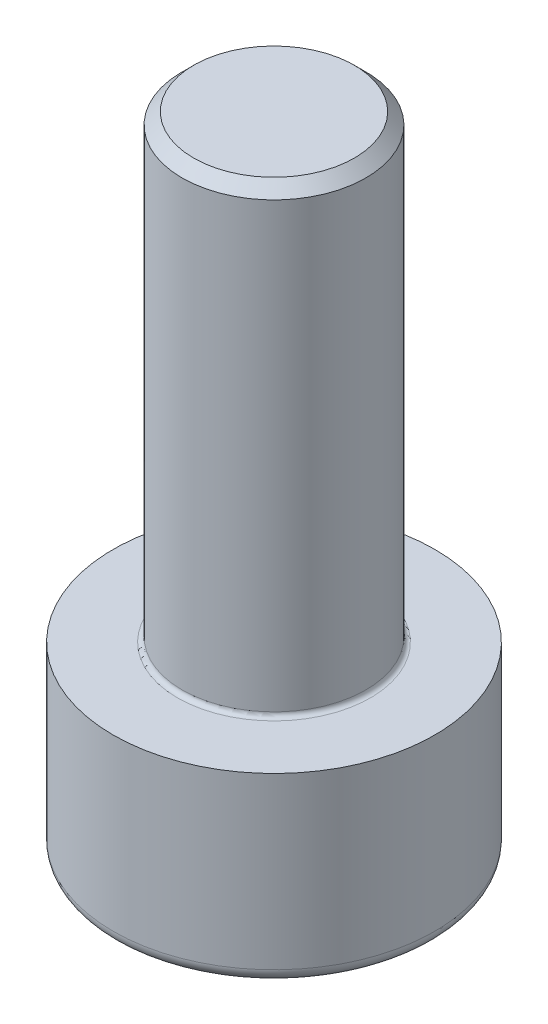
ISO-10303-21;
HEADER;
FILE_DESCRIPTION(('STEP AP214'),'2;1');
FILE_NAME('part.step','',(''),(''),'','','');
FILE_SCHEMA(('AUTOMOTIVE_DESIGN { 1 0 10303 214 1 1 1 1 }'));
ENDSEC;
DATA;
#1=APPLICATION_CONTEXT('core data for automotive mechanical design processes');
#2=APPLICATION_PROTOCOL_DEFINITION('international standard','automotive_design',2000,#1);
#3=PRODUCT_CONTEXT('',#1,'mechanical');
#4=PRODUCT('Part','Part','',(#3));
#5=PRODUCT_RELATED_PRODUCT_CATEGORY('part','',(#4));
#6=PRODUCT_DEFINITION_FORMATION('','',#4);
#7=PRODUCT_DEFINITION_CONTEXT('part definition',#1,'design');
#8=PRODUCT_DEFINITION('design','',#6,#7);
#9=PRODUCT_DEFINITION_SHAPE('','',#8);
#10=(LENGTH_UNIT() NAMED_UNIT(*) SI_UNIT(.MILLI.,.METRE.));
#11=(NAMED_UNIT(*) PLANE_ANGLE_UNIT() SI_UNIT($,.RADIAN.));
#12=(NAMED_UNIT(*) SI_UNIT($,.STERADIAN.) SOLID_ANGLE_UNIT());
#13=UNCERTAINTY_MEASURE_WITH_UNIT(LENGTH_MEASURE(1.E-05),#10,'distance_accuracy_value','');
#14=(GEOMETRIC_REPRESENTATION_CONTEXT(3) GLOBAL_UNCERTAINTY_ASSIGNED_CONTEXT((#13)) GLOBAL_UNIT_ASSIGNED_CONTEXT((#10,
#11,#12)) REPRESENTATION_CONTEXT('',''));
#15=CARTESIAN_POINT('',(0.,0.,0.));
#16=DIRECTION('',(0.,0.,1.));
#17=DIRECTION('',(1.,0.,0.));
#18=AXIS2_PLACEMENT_3D('',#15,#16,#17);
#19=CARTESIAN_POINT('',(3.2,0.,0.));
#20=DIRECTION('',(0.,1.,0.));
#21=DIRECTION('',(0.,0.,1.));
#22=AXIS2_PLACEMENT_3D('',#19,#20,#21);
#23=PLANE('',#22);
#24=CARTESIAN_POINT('',(0.,0.,0.));
#25=DIRECTION('',(0.,1.,0.));
#26=DIRECTION('',(0.,0.,1.));
#27=AXIS2_PLACEMENT_3D('',#24,#25,#26);
#28=CIRCLE('',#27,3.2);
#29=CARTESIAN_POINT('',(0.,0.,3.2));
#30=VERTEX_POINT('',#29);
#31=EDGE_CURVE('E140',#30,#30,#28,.T.);
#32=ORIENTED_EDGE('',*,*,#31,.F.);
#33=EDGE_LOOP('',(#32));
#34=FACE_BOUND('',#33,.T.);
#35=DIRECTION('',(0.,0.,1.));
#36=VECTOR('',#35,1.);
#37=CARTESIAN_POINT('',(-1.5,0.,0.));
#38=LINE('',#37,#36);
#39=CARTESIAN_POINT('',(-1.5,0.,-0.866025403784439));
#40=VERTEX_POINT('',#39);
#41=CARTESIAN_POINT('',(-1.5,0.,0.866025403784439));
#42=VERTEX_POINT('',#41);
#43=EDGE_CURVE('E147',#40,#42,#38,.T.);
#44=ORIENTED_EDGE('',*,*,#43,.T.);
#45=DIRECTION('',(0.866025403784439,0.,0.5));
#46=VECTOR('',#45,1.);
#47=CARTESIAN_POINT('',(1.65,0.,2.68467875173176));
#48=LINE('',#47,#46);
#49=CARTESIAN_POINT('',(0.,0.,1.73205080756888));
#50=VERTEX_POINT('',#49);
#51=EDGE_CURVE('E11',#42,#50,#48,.T.);
#52=ORIENTED_EDGE('',*,*,#51,.T.);
#53=DIRECTION('',(0.866025403784439,0.,-0.5));
#54=VECTOR('',#53,1.);
#55=CARTESIAN_POINT('',(3.15,0.,-0.0866025403784431));
#56=LINE('',#55,#54);
#57=CARTESIAN_POINT('',(1.5,0.,0.866025403784439));
#58=VERTEX_POINT('',#57);
#59=EDGE_CURVE('E50',#50,#58,#56,.T.);
#60=ORIENTED_EDGE('',*,*,#59,.T.);
#61=DIRECTION('',(0.,0.,-1.));
#62=VECTOR('',#61,1.);
#63=CARTESIAN_POINT('',(1.5,0.,0.));
#64=LINE('',#63,#62);
#65=CARTESIAN_POINT('',(1.5,0.,-0.86602540378444));
#66=VERTEX_POINT('',#65);
#67=EDGE_CURVE('E115',#58,#66,#64,.T.);
#68=ORIENTED_EDGE('',*,*,#67,.T.);
#69=DIRECTION('',(-0.866025403784439,0.,-0.5));
#70=VECTOR('',#69,1.);
#71=CARTESIAN_POINT('',(3.15,0.,0.0866025403784426));
#72=LINE('',#71,#70);
#73=CARTESIAN_POINT('',(0.,0.,-1.73205080756888));
#74=VERTEX_POINT('',#73);
#75=EDGE_CURVE('E57',#66,#74,#72,.T.);
#76=ORIENTED_EDGE('',*,*,#75,.T.);
#77=DIRECTION('',(-0.866025403784439,0.,0.5));
#78=VECTOR('',#77,1.);
#79=CARTESIAN_POINT('',(1.65,0.,-2.68467875173176));
#80=LINE('',#79,#78);
#81=EDGE_CURVE('E144',#74,#40,#80,.T.);
#82=ORIENTED_EDGE('',*,*,#81,.T.);
#83=EDGE_LOOP('',(#44,#52,#60,#68,#76,#82));
#84=FACE_BOUND('',#83,.T.);
#85=ADVANCED_FACE('F41',(#34,#84),#23,.F.);
#86=CARTESIAN_POINT('',(0.,0.3,0.));
#87=DIRECTION('',(0.,1.,0.));
#88=DIRECTION('',(0.,0.,1.));
#89=AXIS2_PLACEMENT_3D('',#86,#87,#88);
#90=TOROIDAL_SURFACE('',#89,3.2,0.3);
#91=CARTESIAN_POINT('',(0.,0.3,0.));
#92=DIRECTION('',(0.,1.,0.));
#93=DIRECTION('',(0.,0.,1.));
#94=AXIS2_PLACEMENT_3D('',#91,#92,#93);
#95=CIRCLE('',#94,3.5);
#96=CARTESIAN_POINT('',(0.,0.3,3.5));
#97=VERTEX_POINT('',#96);
#98=EDGE_CURVE('E137',#97,#97,#95,.T.);
#99=ORIENTED_EDGE('',*,*,#98,.F.);
#100=EDGE_LOOP('',(#99));
#101=FACE_BOUND('',#100,.T.);
#102=ORIENTED_EDGE('',*,*,#31,.T.);
#103=EDGE_LOOP('',(#102));
#104=FACE_BOUND('',#103,.T.);
#105=ADVANCED_FACE('F219',(#101,#104),#90,.T.);
#106=CARTESIAN_POINT('',(0.,3.36602540378443,0.));
#107=DIRECTION('',(0.,1.,0.));
#108=DIRECTION('',(0.,0.,1.));
#109=AXIS2_PLACEMENT_3D('',#106,#107,#108);
#110=CYLINDRICAL_SURFACE('',#109,3.5);
#111=CARTESIAN_POINT('',(0.,4.,0.));
#112=DIRECTION('',(0.,1.,0.));
#113=DIRECTION('',(0.,0.,1.));
#114=AXIS2_PLACEMENT_3D('',#111,#112,#113);
#115=CIRCLE('',#114,3.5);
#116=CARTESIAN_POINT('',(0.,4.,3.5));
#117=VERTEX_POINT('',#116);
#118=EDGE_CURVE('E134',#117,#117,#115,.T.);
#119=ORIENTED_EDGE('',*,*,#118,.F.);
#120=EDGE_LOOP('',(#119));
#121=FACE_BOUND('',#120,.T.);
#122=ORIENTED_EDGE('',*,*,#98,.T.);
#123=EDGE_LOOP('',(#122));
#124=FACE_BOUND('',#123,.T.);
#125=ADVANCED_FACE('F225',(#121,#124),#110,.T.);
#126=CARTESIAN_POINT('',(2.1,4.,0.));
#127=DIRECTION('',(0.,-1.,0.));
#128=DIRECTION('',(0.,0.,-1.));
#129=AXIS2_PLACEMENT_3D('',#126,#127,#128);
#130=PLANE('',#129);
#131=CARTESIAN_POINT('',(0.,4.,0.));
#132=DIRECTION('',(0.,1.,0.));
#133=DIRECTION('',(0.,0.,1.));
#134=AXIS2_PLACEMENT_3D('',#131,#132,#133);
#135=CIRCLE('',#134,2.1);
#136=CARTESIAN_POINT('',(0.,4.,2.1));
#137=VERTEX_POINT('',#136);
#138=EDGE_CURVE('E131',#137,#137,#135,.T.);
#139=ORIENTED_EDGE('',*,*,#138,.F.);
#140=EDGE_LOOP('',(#139));
#141=FACE_BOUND('',#140,.T.);
#142=ORIENTED_EDGE('',*,*,#118,.T.);
#143=EDGE_LOOP('',(#142));
#144=FACE_BOUND('',#143,.T.);
#145=ADVANCED_FACE('F232',(#141,#144),#130,.F.);
#146=CARTESIAN_POINT('',(0.,4.1,0.));
#147=DIRECTION('',(0.,1.,0.));
#148=DIRECTION('',(0.,0.,1.));
#149=AXIS2_PLACEMENT_3D('',#146,#147,#148);
#150=TOROIDAL_SURFACE('',#149,2.1,0.0999999999999996);
#151=CARTESIAN_POINT('',(0.,4.1,0.));
#152=DIRECTION('',(0.,1.,0.));
#153=DIRECTION('',(0.,0.,1.));
#154=AXIS2_PLACEMENT_3D('',#151,#152,#153);
#155=CIRCLE('',#154,2.);
#156=CARTESIAN_POINT('',(0.,4.1,2.));
#157=VERTEX_POINT('',#156);
#158=EDGE_CURVE('E128',#157,#157,#155,.T.);
#159=ORIENTED_EDGE('',*,*,#158,.F.);
#160=EDGE_LOOP('',(#159));
#161=FACE_BOUND('',#160,.T.);
#162=ORIENTED_EDGE('',*,*,#138,.T.);
#163=EDGE_LOOP('',(#162));
#164=FACE_BOUND('',#163,.T.);
#165=ADVANCED_FACE('F236',(#161,#164),#150,.F.);
#166=CARTESIAN_POINT('',(0.,3.36602540378443,0.));
#167=DIRECTION('',(0.,1.,0.));
#168=DIRECTION('',(0.,0.,1.));
#169=AXIS2_PLACEMENT_3D('',#166,#167,#168);
#170=CYLINDRICAL_SURFACE('',#169,2.);
#171=CARTESIAN_POINT('',(0.,13.75,0.));
#172=DIRECTION('',(0.,1.,0.));
#173=DIRECTION('',(0.,0.,1.));
#174=AXIS2_PLACEMENT_3D('',#171,#172,#173);
#175=CIRCLE('',#174,2.);
#176=CARTESIAN_POINT('',(0.,13.75,2.));
#177=VERTEX_POINT('',#176);
#178=EDGE_CURVE('E125',#177,#177,#175,.T.);
#179=ORIENTED_EDGE('',*,*,#178,.F.);
#180=EDGE_LOOP('',(#179));
#181=FACE_BOUND('',#180,.T.);
#182=ORIENTED_EDGE('',*,*,#158,.T.);
#183=EDGE_LOOP('',(#182));
#184=FACE_BOUND('',#183,.T.);
#185=ADVANCED_FACE('F240',(#181,#184),#170,.T.);
#186=CARTESIAN_POINT('',(0.,13.75,0.));
#187=DIRECTION('',(0.,-1.,0.));
#188=DIRECTION('',(0.,0.,-1.));
#189=AXIS2_PLACEMENT_3D('',#186,#187,#188);
#190=CONICAL_SURFACE('',#189,2.,0.785398163397449);
#191=CARTESIAN_POINT('',(0.,14.,0.));
#192=DIRECTION('',(0.,1.,0.));
#193=DIRECTION('',(0.,0.,1.));
#194=AXIS2_PLACEMENT_3D('',#191,#192,#193);
#195=CIRCLE('',#194,1.75);
#196=CARTESIAN_POINT('',(0.,14.,1.75));
#197=VERTEX_POINT('',#196);
#198=EDGE_CURVE('E122',#197,#197,#195,.T.);
#199=ORIENTED_EDGE('',*,*,#198,.F.);
#200=EDGE_LOOP('',(#199));
#201=FACE_BOUND('',#200,.T.);
#202=ORIENTED_EDGE('',*,*,#178,.T.);
#203=EDGE_LOOP('',(#202));
#204=FACE_BOUND('',#203,.T.);
#205=ADVANCED_FACE('F243',(#201,#204),#190,.T.);
#206=CARTESIAN_POINT('',(0.,14.,0.));
#207=DIRECTION('',(0.,-1.,0.));
#208=DIRECTION('',(0.,0.,-1.));
#209=AXIS2_PLACEMENT_3D('',#206,#207,#208);
#210=PLANE('',#209);
#211=ORIENTED_EDGE('',*,*,#198,.T.);
#212=EDGE_LOOP('',(#211));
#213=FACE_BOUND('',#212,.T.);
#214=ADVANCED_FACE('F187',(#213),#210,.F.);
#215=CARTESIAN_POINT('',(1.5,14.001,-0.86602540378444));
#216=DIRECTION('',(1.,0.,0.));
#217=DIRECTION('',(0.,0.,-1.));
#218=AXIS2_PLACEMENT_3D('',#215,#216,#217);
#219=PLANE('',#218);
#220=CARTESIAN_POINT('',(1.5,1.76615633816539,-2.32996632623184));
#221=CARTESIAN_POINT('',(1.5,1.79798919613758,-2.26437444405743));
#222=CARTESIAN_POINT('',(1.5,1.82951771395363,-2.19863229169424));
#223=CARTESIAN_POINT('',(1.5,1.89179481354062,-2.06676745292842));
#224=CARTESIAN_POINT('',(1.5,1.92254327266032,-2.00064470866486));
#225=CARTESIAN_POINT('',(1.5,1.98324262927787,-1.8676003652659));
#226=CARTESIAN_POINT('',(1.5,2.01318831424399,-1.80067637977723));
#227=CARTESIAN_POINT('',(1.5,2.07185767508372,-1.6662968712601));
#228=CARTESIAN_POINT('',(1.5,2.1005814087622,-1.59884137355434));
#229=CARTESIAN_POINT('',(1.5,2.15734842955646,-1.46119554597187));
#230=CARTESIAN_POINT('',(1.5,2.18534325721535,-1.3909851216077));
#231=CARTESIAN_POINT('',(1.5,2.23922332312017,-1.24974401581858));
#232=CARTESIAN_POINT('',(1.5,2.26510831015436,-1.17871323786304));
#233=CARTESIAN_POINT('',(1.5,2.3140912965529,-1.03585328703448));
#234=CARTESIAN_POINT('',(1.5,2.33719499634937,-0.964026088455885));
#235=CARTESIAN_POINT('',(1.5,2.37988010488746,-0.819336267507923));
#236=CARTESIAN_POINT('',(1.5,2.39946233610546,-0.746473891216182));
#237=CARTESIAN_POINT('',(1.5,2.43407182681933,-0.600038834781763));
#238=CARTESIAN_POINT('',(1.5,2.44912129597725,-0.526471502773084));
#239=CARTESIAN_POINT('',(1.5,2.47380188898385,-0.37841979945828));
#240=CARTESIAN_POINT('',(1.5,2.48343361989429,-0.303935531851632));
#241=CARTESIAN_POINT('',(1.5,2.49638259784771,-0.155389377953367));
#242=CARTESIAN_POINT('',(1.5,2.49978105179099,-0.0813347760821038));
#243=CARTESIAN_POINT('',(1.5,2.50019860136826,0.0667933634209257));
#244=CARTESIAN_POINT('',(1.5,2.49721733671176,0.140866901885907));
#245=CARTESIAN_POINT('',(1.5,2.48270166431317,0.31820237872139));
#246=CARTESIAN_POINT('',(1.5,2.46820980965233,0.421223191915141));
#247=CARTESIAN_POINT('',(1.5,2.42940462287565,0.625424132349682));
#248=CARTESIAN_POINT('',(1.5,2.40508040284203,0.726602088665644));
#249=CARTESIAN_POINT('',(1.5,2.36286425885552,0.878072123453582));
#250=CARTESIAN_POINT('',(1.5,2.34761532049469,0.929131221757523));
#251=CARTESIAN_POINT('',(1.5,2.31553776956936,1.03071910299924));
#252=CARTESIAN_POINT('',(1.5,2.29871010133696,1.08124818311263));
#253=CARTESIAN_POINT('',(1.5,2.26373467517891,1.18184063305953));
#254=CARTESIAN_POINT('',(1.5,2.24558699388835,1.23190402973888));
#255=CARTESIAN_POINT('',(1.5,2.20818478978808,1.33162204425529));
#256=CARTESIAN_POINT('',(1.5,2.18893011282338,1.38127660405365));
#257=CARTESIAN_POINT('',(1.5,2.12247941085776,1.54805238163589));
#258=CARTESIAN_POINT('',(1.5,2.07317003279146,1.6643311336049));
#259=CARTESIAN_POINT('',(1.5,1.97115258537025,1.89539476178958));
#260=CARTESIAN_POINT('',(1.5,1.91844375558697,2.01017929681206));
#261=CARTESIAN_POINT('',(1.5,1.81066233860476,2.23870653998927));
#262=CARTESIAN_POINT('',(1.5,1.7555884627014,2.352448638095));
#263=CARTESIAN_POINT('',(1.5,1.64377958781576,2.57911532031986));
#264=CARTESIAN_POINT('',(1.5,1.58704451959512,2.69203987011828));
#265=CARTESIAN_POINT('',(1.5,1.41478951413109,3.03041830989001));
#266=CARTESIAN_POINT('',(1.5,1.29747169159144,3.25495506415598));
#267=CARTESIAN_POINT('',(1.5,1.06017570361323,3.70250249990334));
#268=CARTESIAN_POINT('',(1.5,0.940198512737056,3.92551370248337));
#269=CARTESIAN_POINT('',(1.5,0.716234885422655,4.33800890648542));
#270=CARTESIAN_POINT('',(1.5,0.612480393927321,4.52761896818578));
#271=CARTESIAN_POINT('',(1.5,0.40408563953481,4.90637799005358));
#272=CARTESIAN_POINT('',(1.5,0.299445281008878,5.09552689752633));
#273=CARTESIAN_POINT('',(1.5,0.0899722858638113,5.47267963169666));
#274=CARTESIAN_POINT('',(1.5,-0.0148576995931133,5.66068493208303));
#275=CARTESIAN_POINT('',(1.5,-0.224985148787233,6.03640459768373));
#276=CARTESIAN_POINT('',(1.5,-0.330282554965151,6.22411899507922));
#277=CARTESIAN_POINT('',(1.5,-0.43574622028739,6.41173942427433));
#278=B_SPLINE_CURVE_WITH_KNOTS('',3,(#220,#221,#222,#223,#224,#225,#226,#227,#228,#229,#230,
#231,#232,#233,#234,#235,#236,#237,#238,#239,#240,#241,#242,#243,#244,#245,#246,#247,#248,#249,
#250,#251,#252,#253,#254,#255,#256,#257,#258,#259,#260,#261,#262,#263,#264,#265,#266,#267,#268,
#269,#270,#271,#272,#273,#274,#275,#276,#277),.UNSPECIFIED.,.F.,.F.,(4,2,2,2,2,2,2,2,2,2,2,2,2,
2,2,2,2,2,2,2,2,2,2,2,2,2,2,2,4),(0.,0.218727679237431,0.437489539239563,0.657434470111969,
0.877368984808999,1.10410018802423,1.33085834805848,1.55714354037003,1.78337581253515,
2.00848084865878,2.23356065656191,2.4556867184174,2.67782532502993,2.98929496315935,
3.30111045773214,3.46095330353017,3.62070114012727,3.78043970974438,3.9402005779369,
4.319008731487,4.69790191707908,5.07700424693265,5.45612240029467,6.21609690096592,
6.9757973582631,7.62421716197497,8.27270787812166,8.91847630267787,9.56416729750897),.UNSPECIFIED.);
#279=CARTESIAN_POINT('',(1.5,2.36602540378458,-0.866025403784649));
#280=VERTEX_POINT('',#279);
#281=CARTESIAN_POINT('',(1.5,2.36602540378444,0.866025403784439));
#282=VERTEX_POINT('',#281);
#283=EDGE_CURVE('E93',#280,#282,#278,.T.);
#284=ORIENTED_EDGE('',*,*,#283,.F.);
#285=DIRECTION('',(0.,-1.,0.));
#286=VECTOR('',#285,1.);
#287=CARTESIAN_POINT('',(1.5,14.001,-0.86602540378444));
#288=LINE('',#287,#286);
#289=EDGE_CURVE('E120',#280,#66,#288,.T.);
#290=ORIENTED_EDGE('',*,*,#289,.T.);
#291=ORIENTED_EDGE('',*,*,#67,.F.);
#292=DIRECTION('',(0.,-1.,0.));
#293=VECTOR('',#292,1.);
#294=CARTESIAN_POINT('',(1.5,14.001,0.866025403784439));
#295=LINE('',#294,#293);
#296=EDGE_CURVE('E103',#282,#58,#295,.T.);
#297=ORIENTED_EDGE('',*,*,#296,.F.);
#298=EDGE_LOOP('',(#284,#290,#291,#297));
#299=FACE_BOUND('',#298,.T.);
#300=ADVANCED_FACE('F114',(#299),#219,.F.);
#301=CARTESIAN_POINT('',(1.5,14.001,0.866025403784439));
#302=DIRECTION('',(0.5,0.,0.866025403784439));
#303=DIRECTION('',(0.866025403784439,0.,-0.5));
#304=AXIS2_PLACEMENT_3D('',#301,#302,#303);
#305=PLANE('',#304);
#306=CARTESIAN_POINT('',(1.5002,2.36595873045155,0.865909933730602));
#307=CARTESIAN_POINT('',(1.43428070889745,2.38794254723082,0.903968454193447));
#308=CARTESIAN_POINT('',(1.36779241087777,2.40793651431818,0.942355490953073));
#309=CARTESIAN_POINT('',(1.23366433933493,2.44283730281549,1.01979436916421));
#310=CARTESIAN_POINT('',(1.16602218135311,2.45773177567683,1.05884758728358));
#311=CARTESIAN_POINT('',(1.03157622213016,2.48091872268976,1.13646999803241));
#312=CARTESIAN_POINT('',(0.964793115072752,2.48936549228819,1.17502724286933));
#313=CARTESIAN_POINT('',(0.83091243161012,2.49945182648815,1.25232329150577));
#314=CARTESIAN_POINT('',(0.763815342295622,2.50109974064211,1.29106181408333));
#315=CARTESIAN_POINT('',(0.638425268170805,2.4976837809469,1.363455807133));
#316=CARTESIAN_POINT('',(0.580113576780181,2.49345864477602,1.39712207785428));
#317=CARTESIAN_POINT('',(0.463870120461217,2.48006362856733,1.46423526865157));
#318=CARTESIAN_POINT('',(0.405938758031214,2.47088916638415,1.49768195634505));
#319=CARTESIAN_POINT('',(0.289455348660848,2.44795222004501,1.56493368410116));
#320=CARTESIAN_POINT('',(0.230918055453308,2.43409244183855,1.59873020609217));
#321=CARTESIAN_POINT('',(0.11471687661364,2.40263561976334,1.6658189879754));
#322=CARTESIAN_POINT('',(0.0570515005961898,2.38504597411039,1.699112108342));
#323=CARTESIAN_POINT('',(-0.000199999999999711,2.36595873045155,1.73216627762272));
#324=B_SPLINE_CURVE_WITH_KNOTS('',3,(#306,#307,#308,#309,#310,#311,#312,#313,#314,#315,#316,
#317,#318,#319,#320,#321,#322,#323),.UNSPECIFIED.,.F.,.F.,(4,2,2,2,2,2,2,2,4),(0.,
0.237777822177383,0.476127422841919,0.70857706723059,0.94074115925158,1.1429435283589,
1.34533342091876,1.55221450553907,1.75868901573748),.UNSPECIFIED.);
#325=CARTESIAN_POINT('',(0.,2.36602540378444,1.73205080756888));
#326=VERTEX_POINT('',#325);
#327=EDGE_CURVE('E95',#282,#326,#324,.T.);
#328=ORIENTED_EDGE('',*,*,#327,.F.);
#329=ORIENTED_EDGE('',*,*,#296,.T.);
#330=ORIENTED_EDGE('',*,*,#59,.F.);
#331=DIRECTION('',(0.,-1.,0.));
#332=VECTOR('',#331,1.);
#333=CARTESIAN_POINT('',(0.,14.001,1.73205080756888));
#334=LINE('',#333,#332);
#335=EDGE_CURVE('E111',#326,#50,#334,.T.);
#336=ORIENTED_EDGE('',*,*,#335,.F.);
#337=EDGE_LOOP('',(#328,#329,#330,#336));
#338=FACE_BOUND('',#337,.T.);
#339=ADVANCED_FACE('F108',(#338),#305,.F.);
#340=CARTESIAN_POINT('',(0.,14.001,1.73205080756888));
#341=DIRECTION('',(-0.5,0.,0.866025403784439));
#342=DIRECTION('',(0.866025403784439,0.,0.5));
#343=AXIS2_PLACEMENT_3D('',#340,#341,#342);
#344=PLANE('',#343);
#345=CARTESIAN_POINT('',(0.000200000000000196,2.36595873045155,1.73216627762272));
#346=CARTESIAN_POINT('',(-0.0657192911025475,2.38794254723082,1.69410775715987));
#347=CARTESIAN_POINT('',(-0.132207589122235,2.40793651431818,1.65572072040024));
#348=CARTESIAN_POINT('',(-0.26633566066507,2.44283730281549,1.5782818421891));
#349=CARTESIAN_POINT('',(-0.333977818646886,2.45773177567683,1.53922862406973));
#350=CARTESIAN_POINT('',(-0.468423777869843,2.48091872268976,1.4616062133209));
#351=CARTESIAN_POINT('',(-0.535206884927247,2.48936549228819,1.42304896848399));
#352=CARTESIAN_POINT('',(-0.66908756838988,2.49945182648815,1.34575291984755));
#353=CARTESIAN_POINT('',(-0.736184657704378,2.50109974064211,1.30701439726998));
#354=CARTESIAN_POINT('',(-0.861574731829195,2.4976837809469,1.23462040422031));
#355=CARTESIAN_POINT('',(-0.919886423219819,2.49345864477602,1.20095413349903));
#356=CARTESIAN_POINT('',(-1.03612987953878,2.48006362856733,1.13384094270175));
#357=CARTESIAN_POINT('',(-1.09406124196879,2.47088916638415,1.10039425500826));
#358=CARTESIAN_POINT('',(-1.21054465133915,2.44795222004501,1.03314252725216));
#359=CARTESIAN_POINT('',(-1.26908194454669,2.43409244183855,0.999346005261151));
#360=CARTESIAN_POINT('',(-1.38528312338636,2.40263561976334,0.932257223377917));
#361=CARTESIAN_POINT('',(-1.44294849940381,2.38504597411039,0.898964103011321));
#362=CARTESIAN_POINT('',(-1.5002,2.36595873045155,0.865909933730601));
#363=B_SPLINE_CURVE_WITH_KNOTS('',3,(#345,#346,#347,#348,#349,#350,#351,#352,#353,#354,#355,
#356,#357,#358,#359,#360,#361,#362),.UNSPECIFIED.,.F.,.F.,(4,2,2,2,2,2,2,2,4),(0.,
0.237777822177383,0.476127422841919,0.70857706723059,0.94074115925158,1.1429435283589,
1.34533342091876,1.55221450553907,1.75868901573748),.UNSPECIFIED.);
#364=CARTESIAN_POINT('',(-1.5,2.36602540378444,0.866025403784439));
#365=VERTEX_POINT('',#364);
#366=EDGE_CURVE('E153',#326,#365,#363,.T.);
#367=ORIENTED_EDGE('',*,*,#366,.F.);
#368=ORIENTED_EDGE('',*,*,#335,.T.);
#369=ORIENTED_EDGE('',*,*,#51,.F.);
#370=DIRECTION('',(0.,-1.,0.));
#371=VECTOR('',#370,1.);
#372=CARTESIAN_POINT('',(-1.5,14.001,0.866025403784439));
#373=LINE('',#372,#371);
#374=EDGE_CURVE('E154',#365,#42,#373,.T.);
#375=ORIENTED_EDGE('',*,*,#374,.F.);
#376=EDGE_LOOP('',(#367,#368,#369,#375));
#377=FACE_BOUND('',#376,.T.);
#378=ADVANCED_FACE('F150',(#377),#344,.F.);
#379=CARTESIAN_POINT('',(-1.5,14.001,0.866025403784439));
#380=DIRECTION('',(-1.,0.,0.));
#381=DIRECTION('',(0.,0.,1.));
#382=AXIS2_PLACEMENT_3D('',#379,#380,#381);
#383=PLANE('',#382);
#384=CARTESIAN_POINT('',(-1.5,1.76615633816539,-2.32996632623185));
#385=CARTESIAN_POINT('',(-1.5,1.79798919613758,-2.26437444405743));
#386=CARTESIAN_POINT('',(-1.5,1.82951771395363,-2.19863229169424));
#387=CARTESIAN_POINT('',(-1.5,1.89179481354062,-2.06676745292842));
#388=CARTESIAN_POINT('',(-1.5,1.92254327266032,-2.00064470866486));
#389=CARTESIAN_POINT('',(-1.5,1.98324262927787,-1.8676003652659));
#390=CARTESIAN_POINT('',(-1.5,2.01318831424399,-1.80067637977723));
#391=CARTESIAN_POINT('',(-1.5,2.07185767508372,-1.6662968712601));
#392=CARTESIAN_POINT('',(-1.5,2.1005814087622,-1.59884137355434));
#393=CARTESIAN_POINT('',(-1.5,2.15734842955646,-1.46119554597187));
#394=CARTESIAN_POINT('',(-1.5,2.18534325721535,-1.3909851216077));
#395=CARTESIAN_POINT('',(-1.5,2.23922332312017,-1.24974401581858));
#396=CARTESIAN_POINT('',(-1.5,2.26510831015436,-1.17871323786304));
#397=CARTESIAN_POINT('',(-1.5,2.3140912965529,-1.03585328703448));
#398=CARTESIAN_POINT('',(-1.5,2.33719499634937,-0.964026088455886));
#399=CARTESIAN_POINT('',(-1.5,2.37988010488746,-0.819336267507923));
#400=CARTESIAN_POINT('',(-1.5,2.39946233610546,-0.746473891216182));
#401=CARTESIAN_POINT('',(-1.5,2.43407182681933,-0.600038834781763));
#402=CARTESIAN_POINT('',(-1.5,2.44912129597725,-0.526471502773083));
#403=CARTESIAN_POINT('',(-1.5,2.47380188898385,-0.37841979945828));
#404=CARTESIAN_POINT('',(-1.5,2.48343361989429,-0.303935531851631));
#405=CARTESIAN_POINT('',(-1.5,2.49638259784771,-0.155389377953366));
#406=CARTESIAN_POINT('',(-1.5,2.49978105179099,-0.0813347760821032));
#407=CARTESIAN_POINT('',(-1.5,2.50019860136826,0.0667933634209265));
#408=CARTESIAN_POINT('',(-1.5,2.49721733671175,0.140866901885908));
#409=CARTESIAN_POINT('',(-1.5,2.48270166431317,0.318202378721391));
#410=CARTESIAN_POINT('',(-1.5,2.46820980965233,0.421223191915142));
#411=CARTESIAN_POINT('',(-1.5,2.42940462287565,0.625424132349683));
#412=CARTESIAN_POINT('',(-1.5,2.40508040284203,0.726602088665646));
#413=CARTESIAN_POINT('',(-1.5,2.36286425885552,0.878072123453583));
#414=CARTESIAN_POINT('',(-1.5,2.34761532049469,0.929131221757525));
#415=CARTESIAN_POINT('',(-1.5,2.31553776956936,1.03071910299924));
#416=CARTESIAN_POINT('',(-1.5,2.29871010133696,1.08124818311263));
#417=CARTESIAN_POINT('',(-1.5,2.26373467517891,1.18184063305953));
#418=CARTESIAN_POINT('',(-1.5,2.24558699388834,1.23190402973888));
#419=CARTESIAN_POINT('',(-1.5,2.20818478978808,1.33162204425529));
#420=CARTESIAN_POINT('',(-1.5,2.18893011282338,1.38127660405365));
#421=CARTESIAN_POINT('',(-1.5,2.12247941085776,1.54805238163589));
#422=CARTESIAN_POINT('',(-1.5,2.07317003279146,1.66433113360491));
#423=CARTESIAN_POINT('',(-1.5,1.97115258537025,1.89539476178958));
#424=CARTESIAN_POINT('',(-1.5,1.91844375558697,2.01017929681206));
#425=CARTESIAN_POINT('',(-1.5,1.81066233860475,2.23870653998927));
#426=CARTESIAN_POINT('',(-1.5,1.7555884627014,2.352448638095));
#427=CARTESIAN_POINT('',(-1.5,1.64377958781576,2.57911532031986));
#428=CARTESIAN_POINT('',(-1.5,1.58704451959512,2.69203987011829));
#429=CARTESIAN_POINT('',(-1.5,1.41478951413109,3.03041830989002));
#430=CARTESIAN_POINT('',(-1.5,1.29747169159143,3.25495506415599));
#431=CARTESIAN_POINT('',(-1.5,1.06017570361323,3.70250249990335));
#432=CARTESIAN_POINT('',(-1.5,0.94019851273705,3.92551370248338));
#433=CARTESIAN_POINT('',(-1.5,0.716234885422649,4.33800890648543));
#434=CARTESIAN_POINT('',(-1.5,0.612480393927315,4.52761896818579));
#435=CARTESIAN_POINT('',(-1.5,0.404085639534803,4.9063779900536));
#436=CARTESIAN_POINT('',(-1.5,0.299445281008871,5.09552689752635));
#437=CARTESIAN_POINT('',(-1.5,0.0899722858638045,5.47267963169668));
#438=CARTESIAN_POINT('',(-1.5,-0.0148576995931198,5.66068493208305));
#439=CARTESIAN_POINT('',(-1.5,-0.22498514878724,6.03640459768375));
#440=CARTESIAN_POINT('',(-1.5,-0.330282554965157,6.22411899507923));
#441=CARTESIAN_POINT('',(-1.5,-0.435746220287396,6.41173942427434));
#442=B_SPLINE_CURVE_WITH_KNOTS('',3,(#384,#385,#386,#387,#388,#389,#390,#391,#392,#393,#394,
#395,#396,#397,#398,#399,#400,#401,#402,#403,#404,#405,#406,#407,#408,#409,#410,#411,#412,#413,
#414,#415,#416,#417,#418,#419,#420,#421,#422,#423,#424,#425,#426,#427,#428,#429,#430,#431,#432,
#433,#434,#435,#436,#437,#438,#439,#440,#441),.UNSPECIFIED.,.F.,.F.,(4,2,2,2,2,2,2,2,2,2,2,2,2,
2,2,2,2,2,2,2,2,2,2,2,2,2,2,2,4),(0.,0.218727679237432,0.437489539239563,0.657434470111969,
0.877368984808999,1.10410018802423,1.33085834805848,1.55714354037003,1.78337581253515,
2.00848084865878,2.23356065656191,2.4556867184174,2.67782532502993,2.98929496315935,
3.30111045773214,3.46095330353017,3.62070114012727,3.78043970974438,3.9402005779369,
4.319008731487,4.69790191707909,5.07700424693266,5.45612240029468,6.21609690096593,
6.97579735826312,7.62421716197498,8.27270787812168,8.91847630267789,9.56416729750899),.UNSPECIFIED.);
#443=CARTESIAN_POINT('',(-1.5,2.36602540378458,-0.866025403784649));
#444=VERTEX_POINT('',#443);
#445=EDGE_CURVE('E157',#365,#444,#442,.F.);
#446=ORIENTED_EDGE('',*,*,#445,.F.);
#447=ORIENTED_EDGE('',*,*,#374,.T.);
#448=ORIENTED_EDGE('',*,*,#43,.F.);
#449=DIRECTION('',(0.,-1.,0.));
#450=VECTOR('',#449,1.);
#451=CARTESIAN_POINT('',(-1.5,14.001,-0.866025403784439));
#452=LINE('',#451,#450);
#453=EDGE_CURVE('E354',#444,#40,#452,.T.);
#454=ORIENTED_EDGE('',*,*,#453,.F.);
#455=EDGE_LOOP('',(#446,#447,#448,#454));
#456=FACE_BOUND('',#455,.T.);
#457=ADVANCED_FACE('F178',(#456),#383,.F.);
#458=CARTESIAN_POINT('',(-1.5,14.001,-0.866025403784439));
#459=DIRECTION('',(-0.5,0.,-0.866025403784439));
#460=DIRECTION('',(-0.866025403784439,0.,0.5));
#461=AXIS2_PLACEMENT_3D('',#458,#459,#460);
#462=PLANE('',#461);
#463=CARTESIAN_POINT('',(-1.5002,2.36595873045155,-0.865909933730601));
#464=CARTESIAN_POINT('',(-1.43428070889745,2.38794254723082,-0.903968454193446));
#465=CARTESIAN_POINT('',(-1.36779241087777,2.40793651431818,-0.942355490953073));
#466=CARTESIAN_POINT('',(-1.23366433933493,2.44283730281549,-1.01979436916421));
#467=CARTESIAN_POINT('',(-1.16602218135311,2.45773177567683,-1.05884758728358));
#468=CARTESIAN_POINT('',(-1.03157622213016,2.48091872268976,-1.13646999803241));
#469=CARTESIAN_POINT('',(-0.964793115072753,2.48936549228819,-1.17502724286933));
#470=CARTESIAN_POINT('',(-0.83091243161012,2.49945182648815,-1.25232329150577));
#471=CARTESIAN_POINT('',(-0.763815342295622,2.50109974064211,-1.29106181408333));
#472=CARTESIAN_POINT('',(-0.638425268170805,2.4976837809469,-1.363455807133));
#473=CARTESIAN_POINT('',(-0.580113576780181,2.49345864477602,-1.39712207785428));
#474=CARTESIAN_POINT('',(-0.463870120461217,2.48006362856733,-1.46423526865157));
#475=CARTESIAN_POINT('',(-0.405938758031214,2.47088916638415,-1.49768195634505));
#476=CARTESIAN_POINT('',(-0.289455348660848,2.44795222004501,-1.56493368410116));
#477=CARTESIAN_POINT('',(-0.230918055453308,2.43409244183855,-1.59873020609217));
#478=CARTESIAN_POINT('',(-0.11471687661364,2.40263561976335,-1.6658189879754));
#479=CARTESIAN_POINT('',(-0.0570515005961893,2.38504597411039,-1.699112108342));
#480=CARTESIAN_POINT('',(0.000200000000000034,2.36595873045155,-1.73216627762272));
#481=B_SPLINE_CURVE_WITH_KNOTS('',3,(#463,#464,#465,#466,#467,#468,#469,#470,#471,#472,#473,
#474,#475,#476,#477,#478,#479,#480),.UNSPECIFIED.,.F.,.F.,(4,2,2,2,2,2,2,2,4),(0.,
0.237777822177383,0.476127422841919,0.70857706723059,0.94074115925158,1.1429435283589,
1.34533342091876,1.55221450553907,1.75868901573748),.UNSPECIFIED.);
#482=CARTESIAN_POINT('',(0.,2.36602540378444,-1.73205080756888));
#483=VERTEX_POINT('',#482);
#484=EDGE_CURVE('E200',#444,#483,#481,.T.);
#485=ORIENTED_EDGE('',*,*,#484,.F.);
#486=ORIENTED_EDGE('',*,*,#453,.T.);
#487=ORIENTED_EDGE('',*,*,#81,.F.);
#488=DIRECTION('',(0.,-1.,0.));
#489=VECTOR('',#488,1.);
#490=CARTESIAN_POINT('',(0.,14.001,-1.73205080756888));
#491=LINE('',#490,#489);
#492=EDGE_CURVE('E199',#483,#74,#491,.T.);
#493=ORIENTED_EDGE('',*,*,#492,.F.);
#494=EDGE_LOOP('',(#485,#486,#487,#493));
#495=FACE_BOUND('',#494,.T.);
#496=ADVANCED_FACE('F208',(#495),#462,.F.);
#497=CARTESIAN_POINT('',(0.,14.001,-1.73205080756888));
#498=DIRECTION('',(0.5,0.,-0.866025403784439));
#499=DIRECTION('',(-0.866025403784439,0.,-0.5));
#500=AXIS2_PLACEMENT_3D('',#497,#498,#499);
#501=PLANE('',#500);
#502=CARTESIAN_POINT('',(-0.0002,2.36595873045155,-1.73216627762272));
#503=CARTESIAN_POINT('',(0.0657192911025477,2.38794254723082,-1.69410775715987));
#504=CARTESIAN_POINT('',(0.132207589122235,2.40793651431818,-1.65572072040024));
#505=CARTESIAN_POINT('',(0.26633566066507,2.44283730281549,-1.5782818421891));
#506=CARTESIAN_POINT('',(0.333977818646886,2.45773177567683,-1.53922862406973));
#507=CARTESIAN_POINT('',(0.468423777869843,2.48091872268976,-1.4616062133209));
#508=CARTESIAN_POINT('',(0.535206884927248,2.48936549228819,-1.42304896848399));
#509=CARTESIAN_POINT('',(0.669087568389881,2.49945182648815,-1.34575291984755));
#510=CARTESIAN_POINT('',(0.736184657704379,2.50109974064211,-1.30701439726998));
#511=CARTESIAN_POINT('',(0.861574731829196,2.4976837809469,-1.23462040422031));
#512=CARTESIAN_POINT('',(0.91988642321982,2.49345864477602,-1.20095413349903));
#513=CARTESIAN_POINT('',(1.03612987953878,2.48006362856733,-1.13384094270175));
#514=CARTESIAN_POINT('',(1.09406124196879,2.47088916638415,-1.10039425500826));
#515=CARTESIAN_POINT('',(1.21054465133915,2.44795222004501,-1.03314252725216));
#516=CARTESIAN_POINT('',(1.26908194454669,2.43409244183855,-0.999346005261152));
#517=CARTESIAN_POINT('',(1.38528312338636,2.40263561976334,-0.932257223377918));
#518=CARTESIAN_POINT('',(1.44294849940381,2.38504597411039,-0.898964103011322));
#519=CARTESIAN_POINT('',(1.5002,2.36595873045155,-0.865909933730602));
#520=B_SPLINE_CURVE_WITH_KNOTS('',3,(#502,#503,#504,#505,#506,#507,#508,#509,#510,#511,#512,
#513,#514,#515,#516,#517,#518,#519),.UNSPECIFIED.,.F.,.F.,(4,2,2,2,2,2,2,2,4),(0.,
0.237777822177384,0.476127422841919,0.70857706723059,0.940741159251581,1.1429435283589,
1.34533342091876,1.55221450553907,1.75868901573748),.UNSPECIFIED.);
#521=EDGE_CURVE('E98',#483,#280,#520,.T.);
#522=ORIENTED_EDGE('',*,*,#521,.F.);
#523=ORIENTED_EDGE('',*,*,#492,.T.);
#524=ORIENTED_EDGE('',*,*,#75,.F.);
#525=ORIENTED_EDGE('',*,*,#289,.F.);
#526=EDGE_LOOP('',(#522,#523,#524,#525));
#527=FACE_BOUND('',#526,.T.);
#528=ADVANCED_FACE('F205',(#527),#501,.F.);
#529=CARTESIAN_POINT('',(0.,3.36602540378443,0.));
#530=DIRECTION('',(0.,-1.,0.));
#531=DIRECTION('',(0.,0.,-1.));
#532=AXIS2_PLACEMENT_3D('',#529,#530,#531);
#533=CONICAL_SURFACE('',#532,0.,1.0471975511966);
#534=ORIENTED_EDGE('',*,*,#521,.T.);
#535=ORIENTED_EDGE('',*,*,#283,.T.);
#536=ORIENTED_EDGE('',*,*,#327,.T.);
#537=ORIENTED_EDGE('',*,*,#366,.T.);
#538=ORIENTED_EDGE('',*,*,#445,.T.);
#539=ORIENTED_EDGE('',*,*,#484,.T.);
#540=EDGE_LOOP('',(#534,#535,#536,#537,#538,#539));
#541=FACE_BOUND('',#540,.T.);
#542=CARTESIAN_POINT('',(0.,3.36602540378443,0.));
#543=VERTEX_POINT('',#542);
#544=VERTEX_LOOP('',#543);
#545=FACE_BOUND('',#544,.T.);
#546=ADVANCED_FACE('F43',(#541,#545),#533,.F.);
#547=CLOSED_SHELL('',(#85,#105,#125,#145,#165,#185,#205,#214,#300,#339,#378,#457,#496,#528,#546));
#548=MANIFOLD_SOLID_BREP('B2',#547);
#549=ADVANCED_BREP_SHAPE_REPRESENTATION('',(#18,#548),#14);
#550=SHAPE_DEFINITION_REPRESENTATION(#9,#549);
ENDSEC;
END-ISO-10303-21;
